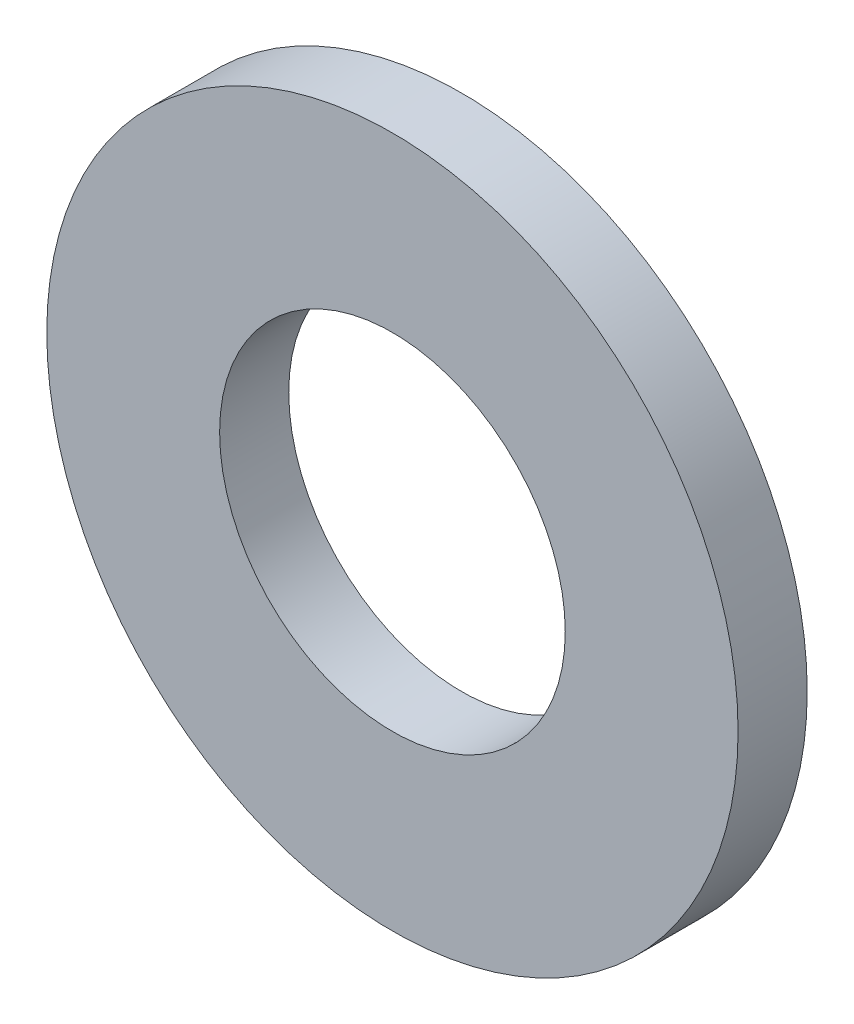
ISO-10303-21;
HEADER;
FILE_DESCRIPTION(('STEP AP214'),'2;1');
FILE_NAME('part.step','',(''),(''),'','','');
FILE_SCHEMA(('AUTOMOTIVE_DESIGN { 1 0 10303 214 1 1 1 1 }'));
ENDSEC;
DATA;
#1=APPLICATION_CONTEXT('core data for automotive mechanical design processes');
#2=APPLICATION_PROTOCOL_DEFINITION('international standard','automotive_design',2000,#1);
#3=PRODUCT_CONTEXT('',#1,'mechanical');
#4=PRODUCT('Part','Part','',(#3));
#5=PRODUCT_RELATED_PRODUCT_CATEGORY('part','',(#4));
#6=PRODUCT_DEFINITION_FORMATION('','',#4);
#7=PRODUCT_DEFINITION_CONTEXT('part definition',#1,'design');
#8=PRODUCT_DEFINITION('design','',#6,#7);
#9=PRODUCT_DEFINITION_SHAPE('','',#8);
#10=(LENGTH_UNIT() NAMED_UNIT(*) SI_UNIT(.MILLI.,.METRE.));
#11=(NAMED_UNIT(*) PLANE_ANGLE_UNIT() SI_UNIT($,.RADIAN.));
#12=(NAMED_UNIT(*) SI_UNIT($,.STERADIAN.) SOLID_ANGLE_UNIT());
#13=UNCERTAINTY_MEASURE_WITH_UNIT(LENGTH_MEASURE(1.E-05),#10,'distance_accuracy_value','');
#14=(GEOMETRIC_REPRESENTATION_CONTEXT(3) GLOBAL_UNCERTAINTY_ASSIGNED_CONTEXT((#13)) GLOBAL_UNIT_ASSIGNED_CONTEXT((#10,
#11,#12)) REPRESENTATION_CONTEXT('',''));
#15=CARTESIAN_POINT('',(0.,0.,0.));
#16=DIRECTION('',(0.,0.,1.));
#17=DIRECTION('',(1.,0.,0.));
#18=AXIS2_PLACEMENT_3D('',#15,#16,#17);
#19=CARTESIAN_POINT('',(0.,0.,0.79375));
#20=DIRECTION('',(0.,0.,1.));
#21=DIRECTION('',(1.,0.,0.));
#22=AXIS2_PLACEMENT_3D('',#19,#20,#21);
#23=PLANE('',#22);
#24=CARTESIAN_POINT('',(0.,0.,0.79375));
#25=DIRECTION('',(0.,0.,1.));
#26=DIRECTION('',(1.,0.,0.));
#27=AXIS2_PLACEMENT_3D('',#24,#25,#26);
#28=CIRCLE('',#27,7.9375);
#29=CARTESIAN_POINT('',(7.9375,0.,0.79375));
#30=VERTEX_POINT('',#29);
#31=EDGE_CURVE('E10',#30,#30,#28,.T.);
#32=ORIENTED_EDGE('',*,*,#31,.T.);
#33=EDGE_LOOP('',(#32));
#34=FACE_BOUND('',#33,.T.);
#35=CARTESIAN_POINT('',(0.,0.,0.79375));
#36=DIRECTION('',(0.,0.,1.));
#37=DIRECTION('',(1.,0.,0.));
#38=AXIS2_PLACEMENT_3D('',#35,#36,#37);
#39=CIRCLE('',#38,3.96875);
#40=CARTESIAN_POINT('',(3.96875,0.,0.79375));
#41=VERTEX_POINT('',#40);
#42=EDGE_CURVE('E44',#41,#41,#39,.T.);
#43=ORIENTED_EDGE('',*,*,#42,.F.);
#44=EDGE_LOOP('',(#43));
#45=FACE_BOUND('',#44,.T.);
#46=ADVANCED_FACE('F33',(#34,#45),#23,.T.);
#47=CARTESIAN_POINT('',(0.,0.,-0.79375));
#48=DIRECTION('',(0.,0.,1.));
#49=DIRECTION('',(1.,0.,0.));
#50=AXIS2_PLACEMENT_3D('',#47,#48,#49);
#51=PLANE('',#50);
#52=CARTESIAN_POINT('',(0.,0.,-0.79375));
#53=DIRECTION('',(0.,0.,1.));
#54=DIRECTION('',(1.,0.,0.));
#55=AXIS2_PLACEMENT_3D('',#52,#53,#54);
#56=CIRCLE('',#55,7.9375);
#57=CARTESIAN_POINT('',(7.9375,0.,-0.79375));
#58=VERTEX_POINT('',#57);
#59=EDGE_CURVE('E37',#58,#58,#56,.T.);
#60=ORIENTED_EDGE('',*,*,#59,.F.);
#61=EDGE_LOOP('',(#60));
#62=FACE_BOUND('',#61,.T.);
#63=CARTESIAN_POINT('',(0.,0.,-0.79375));
#64=DIRECTION('',(0.,0.,1.));
#65=DIRECTION('',(1.,0.,0.));
#66=AXIS2_PLACEMENT_3D('',#63,#64,#65);
#67=CIRCLE('',#66,3.96875);
#68=CARTESIAN_POINT('',(3.96875,0.,-0.79375));
#69=VERTEX_POINT('',#68);
#70=EDGE_CURVE('E46',#69,#69,#67,.T.);
#71=ORIENTED_EDGE('',*,*,#70,.T.);
#72=EDGE_LOOP('',(#71));
#73=FACE_BOUND('',#72,.T.);
#74=ADVANCED_FACE('F56',(#62,#73),#51,.F.);
#75=CARTESIAN_POINT('',(0.,0.,0.79375));
#76=DIRECTION('',(0.,0.,-1.));
#77=DIRECTION('',(-1.,0.,0.));
#78=AXIS2_PLACEMENT_3D('',#75,#76,#77);
#79=CYLINDRICAL_SURFACE('',#78,7.9375);
#80=ORIENTED_EDGE('',*,*,#31,.F.);
#81=EDGE_LOOP('',(#80));
#82=FACE_BOUND('',#81,.T.);
#83=ORIENTED_EDGE('',*,*,#59,.T.);
#84=EDGE_LOOP('',(#83));
#85=FACE_BOUND('',#84,.T.);
#86=ADVANCED_FACE('F35',(#82,#85),#79,.T.);
#87=CARTESIAN_POINT('',(0.,0.,0.79375));
#88=DIRECTION('',(0.,0.,-1.));
#89=DIRECTION('',(-1.,0.,0.));
#90=AXIS2_PLACEMENT_3D('',#87,#88,#89);
#91=CYLINDRICAL_SURFACE('',#90,3.96875);
#92=ORIENTED_EDGE('',*,*,#42,.T.);
#93=EDGE_LOOP('',(#92));
#94=FACE_BOUND('',#93,.T.);
#95=ORIENTED_EDGE('',*,*,#70,.F.);
#96=EDGE_LOOP('',(#95));
#97=FACE_BOUND('',#96,.T.);
#98=ADVANCED_FACE('F52',(#94,#97),#91,.F.);
#99=CLOSED_SHELL('',(#46,#74,#86,#98));
#100=MANIFOLD_SOLID_BREP('B2',#99);
#101=ADVANCED_BREP_SHAPE_REPRESENTATION('',(#18,#100),#14);
#102=SHAPE_DEFINITION_REPRESENTATION(#9,#101);
ENDSEC;
END-ISO-10303-21;
